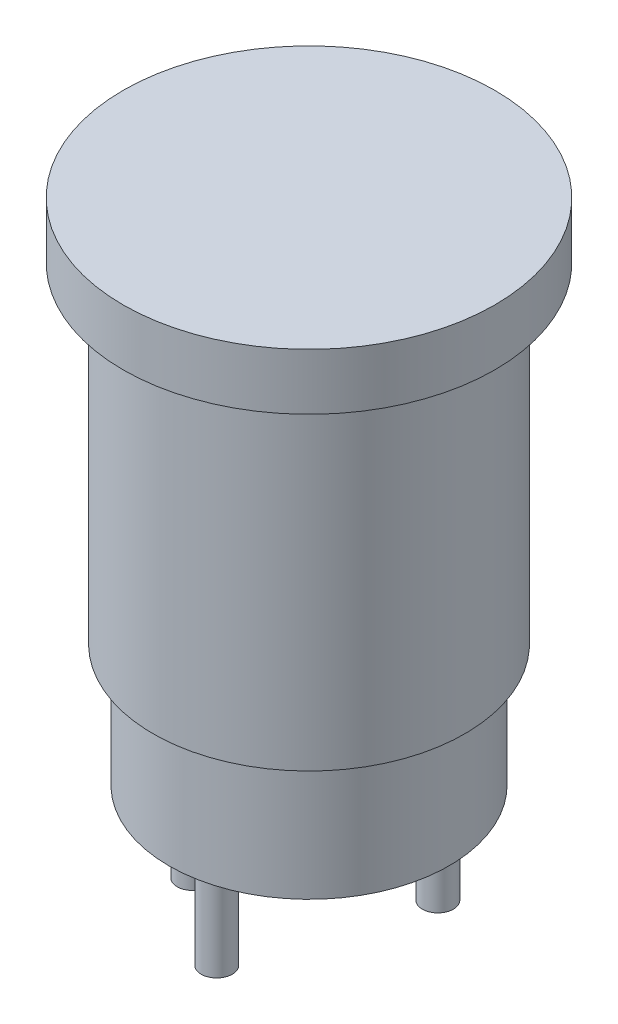
ISO-10303-21;
HEADER;
FILE_DESCRIPTION(('STEP AP214'),'2;1');
FILE_NAME('part.step','',(''),(''),'','','');
FILE_SCHEMA(('AUTOMOTIVE_DESIGN { 1 0 10303 214 1 1 1 1 }'));
ENDSEC;
DATA;
#1=APPLICATION_CONTEXT('core data for automotive mechanical design processes');
#2=APPLICATION_PROTOCOL_DEFINITION('international standard','automotive_design',2000,#1);
#3=PRODUCT_CONTEXT('',#1,'mechanical');
#4=PRODUCT('Part','Part','',(#3));
#5=PRODUCT_RELATED_PRODUCT_CATEGORY('part','',(#4));
#6=PRODUCT_DEFINITION_FORMATION('','',#4);
#7=PRODUCT_DEFINITION_CONTEXT('part definition',#1,'design');
#8=PRODUCT_DEFINITION('design','',#6,#7);
#9=PRODUCT_DEFINITION_SHAPE('','',#8);
#10=(LENGTH_UNIT() NAMED_UNIT(*) SI_UNIT(.MILLI.,.METRE.));
#11=(NAMED_UNIT(*) PLANE_ANGLE_UNIT() SI_UNIT($,.RADIAN.));
#12=(NAMED_UNIT(*) SI_UNIT($,.STERADIAN.) SOLID_ANGLE_UNIT());
#13=UNCERTAINTY_MEASURE_WITH_UNIT(LENGTH_MEASURE(1.E-05),#10,'distance_accuracy_value','');
#14=(GEOMETRIC_REPRESENTATION_CONTEXT(3) GLOBAL_UNCERTAINTY_ASSIGNED_CONTEXT((#13)) GLOBAL_UNIT_ASSIGNED_CONTEXT((#10,
#11,#12)) REPRESENTATION_CONTEXT('',''));
#15=CARTESIAN_POINT('',(0.,0.,0.));
#16=DIRECTION('',(0.,0.,1.));
#17=DIRECTION('',(1.,0.,0.));
#18=AXIS2_PLACEMENT_3D('',#15,#16,#17);
#19=CARTESIAN_POINT('',(5.72835046298677,-20.8,0.));
#20=DIRECTION('',(0.,-1.,0.));
#21=DIRECTION('',(0.,0.,-1.));
#22=AXIS2_PLACEMENT_3D('',#19,#20,#21);
#23=PLANE('',#22);
#24=CARTESIAN_POINT('',(-2.21778942959697,-20.8,-3.05252527430939));
#25=DIRECTION('',(0.,-1.,0.));
#26=DIRECTION('',(0.587785252292469,0.,0.809016994374951));
#27=AXIS2_PLACEMENT_3D('',#24,#25,#26);
#28=CIRCLE('',#27,0.635);
#29=CARTESIAN_POINT('',(-1.84454579439125,-20.8,-2.53879948288129));
#30=VERTEX_POINT('',#29);
#31=EDGE_CURVE('E70',#30,#30,#28,.T.);
#32=ORIENTED_EDGE('',*,*,#31,.F.);
#33=EDGE_LOOP('',(#32));
#34=FACE_BOUND('',#33,.T.);
#35=CARTESIAN_POINT('',(0.,-20.8,3.77312874208258));
#36=DIRECTION('',(0.,-1.,0.));
#37=DIRECTION('',(0.,0.,-1.));
#38=AXIS2_PLACEMENT_3D('',#35,#36,#37);
#39=CIRCLE('',#38,0.635);
#40=CARTESIAN_POINT('',(0.,-20.8,3.13812874208258));
#41=VERTEX_POINT('',#40);
#42=EDGE_CURVE('E58',#41,#41,#39,.T.);
#43=ORIENTED_EDGE('',*,*,#42,.F.);
#44=EDGE_LOOP('',(#43));
#45=FACE_BOUND('',#44,.T.);
#46=CARTESIAN_POINT('',(0.,-20.8,0.));
#47=DIRECTION('',(0.,-1.,0.));
#48=DIRECTION('',(0.,0.,-1.));
#49=AXIS2_PLACEMENT_3D('',#46,#47,#48);
#50=CIRCLE('',#49,5.72835046298677);
#51=CARTESIAN_POINT('',(0.,-20.8,-5.72835046298677));
#52=VERTEX_POINT('',#51);
#53=EDGE_CURVE('E54',#52,#52,#50,.T.);
#54=ORIENTED_EDGE('',*,*,#53,.T.);
#55=EDGE_LOOP('',(#54));
#56=FACE_BOUND('',#55,.T.);
#57=CARTESIAN_POINT('',(-3.58845867697817,-20.8,1.16596090326807));
#58=DIRECTION('',(0.,-1.,0.));
#59=DIRECTION('',(0.951056516295155,0.,-0.309016994374945));
#60=AXIS2_PLACEMENT_3D('',#57,#58,#59);
#61=CIRCLE('',#60,0.635);
#62=CARTESIAN_POINT('',(-2.98453778913075,-20.8,0.969735111839984));
#63=VERTEX_POINT('',#62);
#64=EDGE_CURVE('E64',#63,#63,#61,.T.);
#65=ORIENTED_EDGE('',*,*,#64,.F.);
#66=EDGE_LOOP('',(#65));
#67=FACE_BOUND('',#66,.T.);
#68=CARTESIAN_POINT('',(2.21778942959702,-20.8,-3.05252527430935));
#69=DIRECTION('',(0.,-1.,0.));
#70=DIRECTION('',(-0.58778525229248,0.,0.809016994374942));
#71=AXIS2_PLACEMENT_3D('',#68,#69,#70);
#72=CIRCLE('',#71,0.635);
#73=CARTESIAN_POINT('',(1.84454579439129,-20.8,-2.53879948288126));
#74=VERTEX_POINT('',#73);
#75=EDGE_CURVE('E76',#74,#74,#72,.T.);
#76=ORIENTED_EDGE('',*,*,#75,.F.);
#77=EDGE_LOOP('',(#76));
#78=FACE_BOUND('',#77,.T.);
#79=ADVANCED_FACE('F31',(#34,#45,#56,#67,#78),#23,.T.);
#80=CARTESIAN_POINT('',(0.,0.,0.));
#81=DIRECTION('',(0.,1.,0.));
#82=DIRECTION('',(0.,0.,1.));
#83=AXIS2_PLACEMENT_3D('',#80,#81,#82);
#84=PLANE('',#83);
#85=CARTESIAN_POINT('',(0.,0.,0.));
#86=DIRECTION('',(0.,-1.,0.));
#87=DIRECTION('',(0.,0.,-1.));
#88=AXIS2_PLACEMENT_3D('',#85,#86,#87);
#89=CIRCLE('',#88,7.6);
#90=CARTESIAN_POINT('',(0.,0.,-7.6));
#91=VERTEX_POINT('',#90);
#92=EDGE_CURVE('E10',#91,#91,#89,.T.);
#93=ORIENTED_EDGE('',*,*,#92,.F.);
#94=EDGE_LOOP('',(#93));
#95=FACE_BOUND('',#94,.T.);
#96=ADVANCED_FACE('F33',(#95),#84,.T.);
#97=CARTESIAN_POINT('',(0.,-20.8,0.));
#98=DIRECTION('',(0.,-1.,0.));
#99=DIRECTION('',(0.,0.,-1.));
#100=AXIS2_PLACEMENT_3D('',#97,#98,#99);
#101=CYLINDRICAL_SURFACE('',#100,7.6);
#102=ORIENTED_EDGE('',*,*,#92,.T.);
#103=EDGE_LOOP('',(#102));
#104=FACE_BOUND('',#103,.T.);
#105=CARTESIAN_POINT('',(0.,-2.3,0.));
#106=DIRECTION('',(0.,-1.,0.));
#107=DIRECTION('',(0.,0.,-1.));
#108=AXIS2_PLACEMENT_3D('',#105,#106,#107);
#109=CIRCLE('',#108,7.6);
#110=CARTESIAN_POINT('',(0.,-2.3,-7.6));
#111=VERTEX_POINT('',#110);
#112=EDGE_CURVE('E38',#111,#111,#109,.T.);
#113=ORIENTED_EDGE('',*,*,#112,.F.);
#114=EDGE_LOOP('',(#113));
#115=FACE_BOUND('',#114,.T.);
#116=ADVANCED_FACE('F99',(#104,#115),#101,.T.);
#117=CARTESIAN_POINT('',(7.6,-2.3,0.));
#118=DIRECTION('',(0.,-1.,0.));
#119=DIRECTION('',(0.,0.,-1.));
#120=AXIS2_PLACEMENT_3D('',#117,#118,#119);
#121=PLANE('',#120);
#122=ORIENTED_EDGE('',*,*,#112,.T.);
#123=EDGE_LOOP('',(#122));
#124=FACE_BOUND('',#123,.T.);
#125=CARTESIAN_POINT('',(0.,-2.3,0.));
#126=DIRECTION('',(0.,-1.,0.));
#127=DIRECTION('',(0.,0.,-1.));
#128=AXIS2_PLACEMENT_3D('',#125,#126,#127);
#129=CIRCLE('',#128,6.375);
#130=CARTESIAN_POINT('',(0.,-2.3,-6.375));
#131=VERTEX_POINT('',#130);
#132=EDGE_CURVE('E42',#131,#131,#129,.T.);
#133=ORIENTED_EDGE('',*,*,#132,.F.);
#134=EDGE_LOOP('',(#133));
#135=FACE_BOUND('',#134,.T.);
#136=ADVANCED_FACE('F118',(#124,#135),#121,.T.);
#137=CARTESIAN_POINT('',(0.,-20.8,0.));
#138=DIRECTION('',(0.,-1.,0.));
#139=DIRECTION('',(0.,0.,-1.));
#140=AXIS2_PLACEMENT_3D('',#137,#138,#139);
#141=CYLINDRICAL_SURFACE('',#140,6.375);
#142=ORIENTED_EDGE('',*,*,#132,.T.);
#143=EDGE_LOOP('',(#142));
#144=FACE_BOUND('',#143,.T.);
#145=CARTESIAN_POINT('',(0.,-15.8,0.));
#146=DIRECTION('',(0.,-1.,0.));
#147=DIRECTION('',(0.,0.,-1.));
#148=AXIS2_PLACEMENT_3D('',#145,#146,#147);
#149=CIRCLE('',#148,6.375);
#150=CARTESIAN_POINT('',(0.,-15.8,-6.375));
#151=VERTEX_POINT('',#150);
#152=EDGE_CURVE('E46',#151,#151,#149,.T.);
#153=ORIENTED_EDGE('',*,*,#152,.F.);
#154=EDGE_LOOP('',(#153));
#155=FACE_BOUND('',#154,.T.);
#156=ADVANCED_FACE('F114',(#144,#155),#141,.T.);
#157=CARTESIAN_POINT('',(6.375,-15.8,0.));
#158=DIRECTION('',(0.,-1.,0.));
#159=DIRECTION('',(0.,0.,-1.));
#160=AXIS2_PLACEMENT_3D('',#157,#158,#159);
#161=PLANE('',#160);
#162=ORIENTED_EDGE('',*,*,#152,.T.);
#163=EDGE_LOOP('',(#162));
#164=FACE_BOUND('',#163,.T.);
#165=CARTESIAN_POINT('',(0.,-15.8,0.));
#166=DIRECTION('',(0.,-1.,0.));
#167=DIRECTION('',(0.,0.,-1.));
#168=AXIS2_PLACEMENT_3D('',#165,#166,#167);
#169=CIRCLE('',#168,5.72835046298677);
#170=CARTESIAN_POINT('',(0.,-15.8,-5.72835046298677));
#171=VERTEX_POINT('',#170);
#172=EDGE_CURVE('E51',#171,#171,#169,.T.);
#173=ORIENTED_EDGE('',*,*,#172,.F.);
#174=EDGE_LOOP('',(#173));
#175=FACE_BOUND('',#174,.T.);
#176=ADVANCED_FACE('F110',(#164,#175),#161,.T.);
#177=CARTESIAN_POINT('',(0.,-20.8,0.));
#178=DIRECTION('',(0.,-1.,0.));
#179=DIRECTION('',(0.,0.,-1.));
#180=AXIS2_PLACEMENT_3D('',#177,#178,#179);
#181=CYLINDRICAL_SURFACE('',#180,5.72835046298677);
#182=ORIENTED_EDGE('',*,*,#172,.T.);
#183=EDGE_LOOP('',(#182));
#184=FACE_BOUND('',#183,.T.);
#185=ORIENTED_EDGE('',*,*,#53,.F.);
#186=EDGE_LOOP('',(#185));
#187=FACE_BOUND('',#186,.T.);
#188=ADVANCED_FACE('F107',(#184,#187),#181,.T.);
#189=CARTESIAN_POINT('',(0.,-25.3,3.77312874208258));
#190=DIRECTION('',(0.,1.,0.));
#191=DIRECTION('',(0.,0.,1.));
#192=AXIS2_PLACEMENT_3D('',#189,#190,#191);
#193=CYLINDRICAL_SURFACE('',#192,0.635);
#194=CARTESIAN_POINT('',(0.,-25.3,3.77312874208258));
#195=DIRECTION('',(0.,-1.,0.));
#196=DIRECTION('',(0.,0.,-1.));
#197=AXIS2_PLACEMENT_3D('',#194,#195,#196);
#198=CIRCLE('',#197,0.635);
#199=CARTESIAN_POINT('',(0.,-25.3,3.13812874208258));
#200=VERTEX_POINT('',#199);
#201=EDGE_CURVE('E57',#200,#200,#198,.T.);
#202=ORIENTED_EDGE('',*,*,#201,.F.);
#203=EDGE_LOOP('',(#202));
#204=FACE_BOUND('',#203,.T.);
#205=ORIENTED_EDGE('',*,*,#42,.T.);
#206=EDGE_LOOP('',(#205));
#207=FACE_BOUND('',#206,.T.);
#208=ADVANCED_FACE('F105',(#204,#207),#193,.T.);
#209=CARTESIAN_POINT('',(0.,-25.3,3.77312874208258));
#210=DIRECTION('',(0.,-1.,0.));
#211=DIRECTION('',(0.,0.,-1.));
#212=AXIS2_PLACEMENT_3D('',#209,#210,#211);
#213=PLANE('',#212);
#214=ORIENTED_EDGE('',*,*,#201,.T.);
#215=EDGE_LOOP('',(#214));
#216=FACE_BOUND('',#215,.T.);
#217=ADVANCED_FACE('F155',(#216),#213,.T.);
#218=CARTESIAN_POINT('',(-3.58845867697817,-25.3,1.16596090326807));
#219=DIRECTION('',(0.,1.,0.));
#220=DIRECTION('',(0.,0.,1.));
#221=AXIS2_PLACEMENT_3D('',#218,#219,#220);
#222=CYLINDRICAL_SURFACE('',#221,0.635);
#223=CARTESIAN_POINT('',(-3.58845867697817,-25.3,1.16596090326807));
#224=DIRECTION('',(0.,-1.,0.));
#225=DIRECTION('',(0.951056516295155,0.,-0.309016994374945));
#226=AXIS2_PLACEMENT_3D('',#223,#224,#225);
#227=CIRCLE('',#226,0.635);
#228=CARTESIAN_POINT('',(-2.98453778913075,-25.3,0.969735111839984));
#229=VERTEX_POINT('',#228);
#230=EDGE_CURVE('E61',#229,#229,#227,.T.);
#231=ORIENTED_EDGE('',*,*,#230,.F.);
#232=EDGE_LOOP('',(#231));
#233=FACE_BOUND('',#232,.T.);
#234=ORIENTED_EDGE('',*,*,#64,.T.);
#235=EDGE_LOOP('',(#234));
#236=FACE_BOUND('',#235,.T.);
#237=ADVANCED_FACE('F161',(#233,#236),#222,.T.);
#238=CARTESIAN_POINT('',(-3.58845867697817,-25.3,1.16596090326807));
#239=DIRECTION('',(0.,-1.,0.));
#240=DIRECTION('',(0.951056516295155,0.,-0.309016994374945));
#241=AXIS2_PLACEMENT_3D('',#238,#239,#240);
#242=PLANE('',#241);
#243=ORIENTED_EDGE('',*,*,#230,.T.);
#244=EDGE_LOOP('',(#243));
#245=FACE_BOUND('',#244,.T.);
#246=ADVANCED_FACE('F166',(#245),#242,.T.);
#247=CARTESIAN_POINT('',(-2.21778942959697,-25.3,-3.05252527430939));
#248=DIRECTION('',(0.,1.,0.));
#249=DIRECTION('',(0.,0.,1.));
#250=AXIS2_PLACEMENT_3D('',#247,#248,#249);
#251=CYLINDRICAL_SURFACE('',#250,0.635);
#252=CARTESIAN_POINT('',(-2.21778942959697,-25.3,-3.05252527430939));
#253=DIRECTION('',(0.,-1.,0.));
#254=DIRECTION('',(0.587785252292469,0.,0.809016994374951));
#255=AXIS2_PLACEMENT_3D('',#252,#253,#254);
#256=CIRCLE('',#255,0.635);
#257=CARTESIAN_POINT('',(-1.84454579439125,-25.3,-2.53879948288129));
#258=VERTEX_POINT('',#257);
#259=EDGE_CURVE('E67',#258,#258,#256,.T.);
#260=ORIENTED_EDGE('',*,*,#259,.F.);
#261=EDGE_LOOP('',(#260));
#262=FACE_BOUND('',#261,.T.);
#263=ORIENTED_EDGE('',*,*,#31,.T.);
#264=EDGE_LOOP('',(#263));
#265=FACE_BOUND('',#264,.T.);
#266=ADVANCED_FACE('F173',(#262,#265),#251,.T.);
#267=CARTESIAN_POINT('',(-2.21778942959697,-25.3,-3.05252527430939));
#268=DIRECTION('',(0.,-1.,0.));
#269=DIRECTION('',(0.587785252292469,0.,0.809016994374951));
#270=AXIS2_PLACEMENT_3D('',#267,#268,#269);
#271=PLANE('',#270);
#272=ORIENTED_EDGE('',*,*,#259,.T.);
#273=EDGE_LOOP('',(#272));
#274=FACE_BOUND('',#273,.T.);
#275=ADVANCED_FACE('F87',(#274),#271,.T.);
#276=CARTESIAN_POINT('',(2.21778942959702,-25.3,-3.05252527430935));
#277=DIRECTION('',(0.,1.,0.));
#278=DIRECTION('',(0.,0.,1.));
#279=AXIS2_PLACEMENT_3D('',#276,#277,#278);
#280=CYLINDRICAL_SURFACE('',#279,0.635);
#281=CARTESIAN_POINT('',(2.21778942959702,-25.3,-3.05252527430935));
#282=DIRECTION('',(0.,-1.,0.));
#283=DIRECTION('',(-0.58778525229248,0.,0.809016994374942));
#284=AXIS2_PLACEMENT_3D('',#281,#282,#283);
#285=CIRCLE('',#284,0.635);
#286=CARTESIAN_POINT('',(1.84454579439129,-25.3,-2.53879948288126));
#287=VERTEX_POINT('',#286);
#288=EDGE_CURVE('E73',#287,#287,#285,.T.);
#289=ORIENTED_EDGE('',*,*,#288,.F.);
#290=EDGE_LOOP('',(#289));
#291=FACE_BOUND('',#290,.T.);
#292=ORIENTED_EDGE('',*,*,#75,.T.);
#293=EDGE_LOOP('',(#292));
#294=FACE_BOUND('',#293,.T.);
#295=ADVANCED_FACE('F84',(#291,#294),#280,.T.);
#296=CARTESIAN_POINT('',(2.21778942959702,-25.3,-3.05252527430935));
#297=DIRECTION('',(0.,-1.,0.));
#298=DIRECTION('',(-0.58778525229248,0.,0.809016994374942));
#299=AXIS2_PLACEMENT_3D('',#296,#297,#298);
#300=PLANE('',#299);
#301=ORIENTED_EDGE('',*,*,#288,.T.);
#302=EDGE_LOOP('',(#301));
#303=FACE_BOUND('',#302,.T.);
#304=ADVANCED_FACE('F82',(#303),#300,.T.);
#305=CLOSED_SHELL('',(#79,#96,#116,#136,#156,#176,#188,#208,#217,#237,#246,#266,#275,#295,#304));
#306=MANIFOLD_SOLID_BREP('B2',#305);
#307=ADVANCED_BREP_SHAPE_REPRESENTATION('',(#18,#306),#14);
#308=SHAPE_DEFINITION_REPRESENTATION(#9,#307);
ENDSEC;
END-ISO-10303-21;
